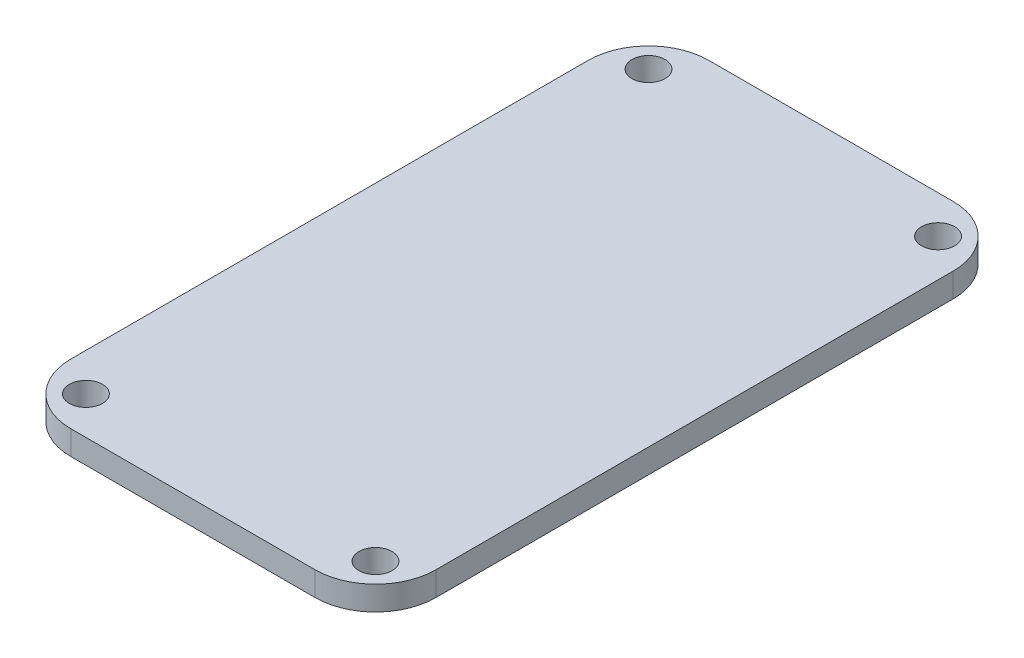
ISO-10303-21;
HEADER;
FILE_DESCRIPTION(('STEP AP214'),'2;1');
FILE_NAME('part.step','',(''),(''),'','','');
FILE_SCHEMA(('AUTOMOTIVE_DESIGN { 1 0 10303 214 1 1 1 1 }'));
ENDSEC;
DATA;
#1=APPLICATION_CONTEXT('core data for automotive mechanical design processes');
#2=APPLICATION_PROTOCOL_DEFINITION('international standard','automotive_design',2000,#1);
#3=PRODUCT_CONTEXT('',#1,'mechanical');
#4=PRODUCT('Part','Part','',(#3));
#5=PRODUCT_RELATED_PRODUCT_CATEGORY('part','',(#4));
#6=PRODUCT_DEFINITION_FORMATION('','',#4);
#7=PRODUCT_DEFINITION_CONTEXT('part definition',#1,'design');
#8=PRODUCT_DEFINITION('design','',#6,#7);
#9=PRODUCT_DEFINITION_SHAPE('','',#8);
#10=(LENGTH_UNIT() NAMED_UNIT(*) SI_UNIT(.MILLI.,.METRE.));
#11=(NAMED_UNIT(*) PLANE_ANGLE_UNIT() SI_UNIT($,.RADIAN.));
#12=(NAMED_UNIT(*) SI_UNIT($,.STERADIAN.) SOLID_ANGLE_UNIT());
#13=UNCERTAINTY_MEASURE_WITH_UNIT(LENGTH_MEASURE(1.E-05),#10,'distance_accuracy_value','');
#14=(GEOMETRIC_REPRESENTATION_CONTEXT(3) GLOBAL_UNCERTAINTY_ASSIGNED_CONTEXT((#13)) GLOBAL_UNIT_ASSIGNED_CONTEXT((#10,
#11,#12)) REPRESENTATION_CONTEXT('',''));
#15=CARTESIAN_POINT('',(0.,0.,0.));
#16=DIRECTION('',(0.,0.,1.));
#17=DIRECTION('',(1.,0.,0.));
#18=AXIS2_PLACEMENT_3D('',#15,#16,#17);
#19=CARTESIAN_POINT('',(12.1,1.6,21.15));
#20=DIRECTION('',(-1.,0.,0.));
#21=DIRECTION('',(0.,0.,1.));
#22=AXIS2_PLACEMENT_3D('',#19,#20,#21);
#23=PLANE('',#22);
#24=DIRECTION('',(0.,0.,-1.));
#25=VECTOR('',#24,1.);
#26=CARTESIAN_POINT('',(12.1,0.,21.15));
#27=LINE('',#26,#25);
#28=CARTESIAN_POINT('',(12.1,0.,17.15));
#29=VERTEX_POINT('',#28);
#30=CARTESIAN_POINT('',(12.1,0.,-17.15));
#31=VERTEX_POINT('',#30);
#32=EDGE_CURVE('E165',#29,#31,#27,.T.);
#33=ORIENTED_EDGE('',*,*,#32,.T.);
#34=DIRECTION('',(0.,-1.,0.));
#35=VECTOR('',#34,1.);
#36=CARTESIAN_POINT('',(12.1,1.6,-17.15));
#37=LINE('',#36,#35);
#38=CARTESIAN_POINT('',(12.1,1.6,-17.15));
#39=VERTEX_POINT('',#38);
#40=EDGE_CURVE('E11',#31,#39,#37,.F.);
#41=ORIENTED_EDGE('',*,*,#40,.T.);
#42=DIRECTION('',(0.,0.,-1.));
#43=VECTOR('',#42,1.);
#44=CARTESIAN_POINT('',(12.1,1.6,21.15));
#45=LINE('',#44,#43);
#46=CARTESIAN_POINT('',(12.1,1.6,17.15));
#47=VERTEX_POINT('',#46);
#48=EDGE_CURVE('E133',#47,#39,#45,.T.);
#49=ORIENTED_EDGE('',*,*,#48,.F.);
#50=DIRECTION('',(0.,-1.,0.));
#51=VECTOR('',#50,1.);
#52=CARTESIAN_POINT('',(12.1,1.6,17.15));
#53=LINE('',#52,#51);
#54=EDGE_CURVE('E49',#47,#29,#53,.T.);
#55=ORIENTED_EDGE('',*,*,#54,.T.);
#56=EDGE_LOOP('',(#33,#41,#49,#55));
#57=FACE_BOUND('',#56,.T.);
#58=ADVANCED_FACE('F41',(#57),#23,.F.);
#59=CARTESIAN_POINT('',(-12.1,1.6,-21.15));
#60=DIRECTION('',(0.,0.,1.));
#61=DIRECTION('',(1.,0.,0.));
#62=AXIS2_PLACEMENT_3D('',#59,#60,#61);
#63=PLANE('',#62);
#64=DIRECTION('',(-1.,0.,0.));
#65=VECTOR('',#64,1.);
#66=CARTESIAN_POINT('',(-12.1,0.,-21.15));
#67=LINE('',#66,#65);
#68=CARTESIAN_POINT('',(8.1,0.,-21.15));
#69=VERTEX_POINT('',#68);
#70=CARTESIAN_POINT('',(-8.1,0.,-21.15));
#71=VERTEX_POINT('',#70);
#72=EDGE_CURVE('E138',#69,#71,#67,.T.);
#73=ORIENTED_EDGE('',*,*,#72,.T.);
#74=DIRECTION('',(0.,-1.,0.));
#75=VECTOR('',#74,1.);
#76=CARTESIAN_POINT('',(-8.1,1.6,-21.15));
#77=LINE('',#76,#75);
#78=CARTESIAN_POINT('',(-8.1,1.6,-21.15));
#79=VERTEX_POINT('',#78);
#80=EDGE_CURVE('E56',#71,#79,#77,.F.);
#81=ORIENTED_EDGE('',*,*,#80,.T.);
#82=DIRECTION('',(-1.,0.,0.));
#83=VECTOR('',#82,1.);
#84=CARTESIAN_POINT('',(-12.1,1.6,-21.15));
#85=LINE('',#84,#83);
#86=CARTESIAN_POINT('',(8.1,1.6,-21.15));
#87=VERTEX_POINT('',#86);
#88=EDGE_CURVE('E136',#87,#79,#85,.T.);
#89=ORIENTED_EDGE('',*,*,#88,.F.);
#90=DIRECTION('',(0.,-1.,0.));
#91=VECTOR('',#90,1.);
#92=CARTESIAN_POINT('',(8.1,1.6,-21.15));
#93=LINE('',#92,#91);
#94=EDGE_CURVE('E157',#87,#69,#93,.T.);
#95=ORIENTED_EDGE('',*,*,#94,.T.);
#96=EDGE_LOOP('',(#73,#81,#89,#95));
#97=FACE_BOUND('',#96,.T.);
#98=ADVANCED_FACE('F225',(#97),#63,.F.);
#99=CARTESIAN_POINT('',(-12.1,1.6,21.15));
#100=DIRECTION('',(1.,0.,0.));
#101=DIRECTION('',(0.,0.,-1.));
#102=AXIS2_PLACEMENT_3D('',#99,#100,#101);
#103=PLANE('',#102);
#104=DIRECTION('',(0.,0.,1.));
#105=VECTOR('',#104,1.);
#106=CARTESIAN_POINT('',(-12.1,0.,21.15));
#107=LINE('',#106,#105);
#108=CARTESIAN_POINT('',(-12.1,0.,-17.15));
#109=VERTEX_POINT('',#108);
#110=CARTESIAN_POINT('',(-12.1,0.,17.15));
#111=VERTEX_POINT('',#110);
#112=EDGE_CURVE('E134',#109,#111,#107,.T.);
#113=ORIENTED_EDGE('',*,*,#112,.T.);
#114=DIRECTION('',(0.,-1.,0.));
#115=VECTOR('',#114,1.);
#116=CARTESIAN_POINT('',(-12.1,1.6,17.15));
#117=LINE('',#116,#115);
#118=CARTESIAN_POINT('',(-12.1,1.6,17.15));
#119=VERTEX_POINT('',#118);
#120=EDGE_CURVE('E112',#111,#119,#117,.F.);
#121=ORIENTED_EDGE('',*,*,#120,.T.);
#122=DIRECTION('',(0.,0.,1.));
#123=VECTOR('',#122,1.);
#124=CARTESIAN_POINT('',(-12.1,1.6,21.15));
#125=LINE('',#124,#123);
#126=CARTESIAN_POINT('',(-12.1,1.6,-17.15));
#127=VERTEX_POINT('',#126);
#128=EDGE_CURVE('E177',#127,#119,#125,.T.);
#129=ORIENTED_EDGE('',*,*,#128,.F.);
#130=DIRECTION('',(0.,-1.,0.));
#131=VECTOR('',#130,1.);
#132=CARTESIAN_POINT('',(-12.1,1.6,-17.15));
#133=LINE('',#132,#131);
#134=EDGE_CURVE('E117',#127,#109,#133,.T.);
#135=ORIENTED_EDGE('',*,*,#134,.T.);
#136=EDGE_LOOP('',(#113,#121,#129,#135));
#137=FACE_BOUND('',#136,.T.);
#138=ADVANCED_FACE('F222',(#137),#103,.F.);
#139=CARTESIAN_POINT('',(-12.1,1.6,21.15));
#140=DIRECTION('',(0.,0.,-1.));
#141=DIRECTION('',(-1.,0.,0.));
#142=AXIS2_PLACEMENT_3D('',#139,#140,#141);
#143=PLANE('',#142);
#144=DIRECTION('',(1.,0.,0.));
#145=VECTOR('',#144,1.);
#146=CARTESIAN_POINT('',(-12.1,1.6,21.15));
#147=LINE('',#146,#145);
#148=CARTESIAN_POINT('',(-8.1,1.6,21.15));
#149=VERTEX_POINT('',#148);
#150=CARTESIAN_POINT('',(8.1,1.6,21.15));
#151=VERTEX_POINT('',#150);
#152=EDGE_CURVE('E127',#149,#151,#147,.T.);
#153=ORIENTED_EDGE('',*,*,#152,.F.);
#154=DIRECTION('',(0.,-1.,0.));
#155=VECTOR('',#154,1.);
#156=CARTESIAN_POINT('',(-8.1,1.6,21.15));
#157=LINE('',#156,#155);
#158=CARTESIAN_POINT('',(-8.1,0.,21.15));
#159=VERTEX_POINT('',#158);
#160=EDGE_CURVE('E111',#149,#159,#157,.T.);
#161=ORIENTED_EDGE('',*,*,#160,.T.);
#162=DIRECTION('',(1.,0.,0.));
#163=VECTOR('',#162,1.);
#164=CARTESIAN_POINT('',(-12.1,0.,21.15));
#165=LINE('',#164,#163);
#166=CARTESIAN_POINT('',(8.1,0.,21.15));
#167=VERTEX_POINT('',#166);
#168=EDGE_CURVE('E124',#159,#167,#165,.T.);
#169=ORIENTED_EDGE('',*,*,#168,.T.);
#170=DIRECTION('',(0.,-1.,0.));
#171=VECTOR('',#170,1.);
#172=CARTESIAN_POINT('',(8.1,1.6,21.15));
#173=LINE('',#172,#171);
#174=EDGE_CURVE('E129',#167,#151,#173,.F.);
#175=ORIENTED_EDGE('',*,*,#174,.T.);
#176=EDGE_LOOP('',(#153,#161,#169,#175));
#177=FACE_BOUND('',#176,.T.);
#178=ADVANCED_FACE('F123',(#177),#143,.F.);
#179=CARTESIAN_POINT('',(0.,1.6,0.));
#180=DIRECTION('',(0.,-1.,0.));
#181=DIRECTION('',(0.,0.,-1.));
#182=AXIS2_PLACEMENT_3D('',#179,#180,#181);
#183=PLANE('',#182);
#184=CARTESIAN_POINT('',(-9.60000000000001,1.6,18.65));
#185=DIRECTION('',(0.,-1.,0.));
#186=DIRECTION('',(0.,0.,-1.));
#187=AXIS2_PLACEMENT_3D('',#184,#185,#186);
#188=CIRCLE('',#187,1.1);
#189=CARTESIAN_POINT('',(-9.60000000000001,1.6,17.55));
#190=VERTEX_POINT('',#189);
#191=EDGE_CURVE('E170',#190,#190,#188,.T.);
#192=ORIENTED_EDGE('',*,*,#191,.T.);
#193=EDGE_LOOP('',(#192));
#194=FACE_BOUND('',#193,.T.);
#195=CARTESIAN_POINT('',(9.60000000000002,1.6,18.65));
#196=DIRECTION('',(0.,-1.,0.));
#197=DIRECTION('',(0.,0.,-1.));
#198=AXIS2_PLACEMENT_3D('',#195,#196,#197);
#199=CIRCLE('',#198,1.1);
#200=CARTESIAN_POINT('',(9.60000000000002,1.6,17.55));
#201=VERTEX_POINT('',#200);
#202=EDGE_CURVE('E173',#201,#201,#199,.T.);
#203=ORIENTED_EDGE('',*,*,#202,.T.);
#204=EDGE_LOOP('',(#203));
#205=FACE_BOUND('',#204,.T.);
#206=CARTESIAN_POINT('',(9.60000000000002,1.6,-18.65));
#207=DIRECTION('',(0.,-1.,0.));
#208=DIRECTION('',(0.,0.,-1.));
#209=AXIS2_PLACEMENT_3D('',#206,#207,#208);
#210=CIRCLE('',#209,1.1);
#211=CARTESIAN_POINT('',(9.60000000000002,1.6,-19.75));
#212=VERTEX_POINT('',#211);
#213=EDGE_CURVE('E183',#212,#212,#210,.T.);
#214=ORIENTED_EDGE('',*,*,#213,.T.);
#215=EDGE_LOOP('',(#214));
#216=FACE_BOUND('',#215,.T.);
#217=CARTESIAN_POINT('',(-9.60000000000002,1.6,-18.65));
#218=DIRECTION('',(0.,-1.,0.));
#219=DIRECTION('',(0.,0.,-1.));
#220=AXIS2_PLACEMENT_3D('',#217,#218,#219);
#221=CIRCLE('',#220,1.1);
#222=CARTESIAN_POINT('',(-9.60000000000002,1.6,-19.75));
#223=VERTEX_POINT('',#222);
#224=EDGE_CURVE('E186',#223,#223,#221,.T.);
#225=ORIENTED_EDGE('',*,*,#224,.T.);
#226=EDGE_LOOP('',(#225));
#227=FACE_BOUND('',#226,.T.);
#228=ORIENTED_EDGE('',*,*,#128,.T.);
#229=CARTESIAN_POINT('',(-8.1,1.6,17.15));
#230=DIRECTION('',(0.,-1.,0.));
#231=DIRECTION('',(0.,0.,-1.));
#232=AXIS2_PLACEMENT_3D('',#229,#230,#231);
#233=CIRCLE('',#232,4.);
#234=EDGE_CURVE('E155',#119,#149,#233,.F.);
#235=ORIENTED_EDGE('',*,*,#234,.T.);
#236=ORIENTED_EDGE('',*,*,#152,.T.);
#237=CARTESIAN_POINT('',(8.1,1.6,17.15));
#238=DIRECTION('',(0.,-1.,0.));
#239=DIRECTION('',(0.,0.,-1.));
#240=AXIS2_PLACEMENT_3D('',#237,#238,#239);
#241=CIRCLE('',#240,4.);
#242=EDGE_CURVE('E150',#151,#47,#241,.F.);
#243=ORIENTED_EDGE('',*,*,#242,.T.);
#244=ORIENTED_EDGE('',*,*,#48,.T.);
#245=CARTESIAN_POINT('',(8.1,1.6,-17.15));
#246=DIRECTION('',(0.,-1.,0.));
#247=DIRECTION('',(0.,0.,-1.));
#248=AXIS2_PLACEMENT_3D('',#245,#246,#247);
#249=CIRCLE('',#248,4.);
#250=EDGE_CURVE('E63',#39,#87,#249,.F.);
#251=ORIENTED_EDGE('',*,*,#250,.T.);
#252=ORIENTED_EDGE('',*,*,#88,.T.);
#253=CARTESIAN_POINT('',(-8.1,1.6,-17.15));
#254=DIRECTION('',(0.,-1.,0.));
#255=DIRECTION('',(0.,0.,-1.));
#256=AXIS2_PLACEMENT_3D('',#253,#254,#255);
#257=CIRCLE('',#256,4.);
#258=EDGE_CURVE('E153',#79,#127,#257,.F.);
#259=ORIENTED_EDGE('',*,*,#258,.T.);
#260=EDGE_LOOP('',(#228,#235,#236,#243,#244,#251,#252,#259));
#261=FACE_BOUND('',#260,.T.);
#262=ADVANCED_FACE('F212',(#194,#205,#216,#227,#261),#183,.F.);
#263=CARTESIAN_POINT('',(0.,0.,0.));
#264=DIRECTION('',(0.,-1.,0.));
#265=DIRECTION('',(0.,0.,-1.));
#266=AXIS2_PLACEMENT_3D('',#263,#264,#265);
#267=PLANE('',#266);
#268=CARTESIAN_POINT('',(-9.60000000000001,0.,18.65));
#269=DIRECTION('',(0.,1.,0.));
#270=DIRECTION('',(0.,0.,1.));
#271=AXIS2_PLACEMENT_3D('',#268,#269,#270);
#272=CIRCLE('',#271,1.1);
#273=CARTESIAN_POINT('',(-9.60000000000001,0.,19.75));
#274=VERTEX_POINT('',#273);
#275=EDGE_CURVE('E193',#274,#274,#272,.T.);
#276=ORIENTED_EDGE('',*,*,#275,.T.);
#277=EDGE_LOOP('',(#276));
#278=FACE_BOUND('',#277,.T.);
#279=CARTESIAN_POINT('',(9.60000000000002,0.,18.65));
#280=DIRECTION('',(0.,1.,0.));
#281=DIRECTION('',(0.,0.,1.));
#282=AXIS2_PLACEMENT_3D('',#279,#280,#281);
#283=CIRCLE('',#282,1.1);
#284=CARTESIAN_POINT('',(9.60000000000002,0.,19.75));
#285=VERTEX_POINT('',#284);
#286=EDGE_CURVE('E196',#285,#285,#283,.T.);
#287=ORIENTED_EDGE('',*,*,#286,.T.);
#288=EDGE_LOOP('',(#287));
#289=FACE_BOUND('',#288,.T.);
#290=CARTESIAN_POINT('',(9.60000000000002,0.,-18.65));
#291=DIRECTION('',(0.,1.,0.));
#292=DIRECTION('',(0.,0.,1.));
#293=AXIS2_PLACEMENT_3D('',#290,#291,#292);
#294=CIRCLE('',#293,1.1);
#295=CARTESIAN_POINT('',(9.60000000000002,0.,-17.55));
#296=VERTEX_POINT('',#295);
#297=EDGE_CURVE('E192',#296,#296,#294,.T.);
#298=ORIENTED_EDGE('',*,*,#297,.T.);
#299=EDGE_LOOP('',(#298));
#300=FACE_BOUND('',#299,.T.);
#301=CARTESIAN_POINT('',(-9.60000000000002,0.,-18.65));
#302=DIRECTION('',(0.,1.,0.));
#303=DIRECTION('',(0.,0.,1.));
#304=AXIS2_PLACEMENT_3D('',#301,#302,#303);
#305=CIRCLE('',#304,1.1);
#306=CARTESIAN_POINT('',(-9.60000000000002,0.,-17.55));
#307=VERTEX_POINT('',#306);
#308=EDGE_CURVE('E189',#307,#307,#305,.T.);
#309=ORIENTED_EDGE('',*,*,#308,.T.);
#310=EDGE_LOOP('',(#309));
#311=FACE_BOUND('',#310,.T.);
#312=ORIENTED_EDGE('',*,*,#168,.F.);
#313=CARTESIAN_POINT('',(-8.1,0.,17.15));
#314=DIRECTION('',(0.,-1.,0.));
#315=DIRECTION('',(0.,0.,-1.));
#316=AXIS2_PLACEMENT_3D('',#313,#314,#315);
#317=CIRCLE('',#316,4.);
#318=EDGE_CURVE('E107',#159,#111,#317,.T.);
#319=ORIENTED_EDGE('',*,*,#318,.T.);
#320=ORIENTED_EDGE('',*,*,#112,.F.);
#321=CARTESIAN_POINT('',(-8.1,0.,-17.15));
#322=DIRECTION('',(0.,-1.,0.));
#323=DIRECTION('',(0.,0.,-1.));
#324=AXIS2_PLACEMENT_3D('',#321,#322,#323);
#325=CIRCLE('',#324,4.);
#326=EDGE_CURVE('E118',#109,#71,#325,.T.);
#327=ORIENTED_EDGE('',*,*,#326,.T.);
#328=ORIENTED_EDGE('',*,*,#72,.F.);
#329=CARTESIAN_POINT('',(8.1,0.,-17.15));
#330=DIRECTION('',(0.,-1.,0.));
#331=DIRECTION('',(0.,0.,-1.));
#332=AXIS2_PLACEMENT_3D('',#329,#330,#331);
#333=CIRCLE('',#332,4.);
#334=EDGE_CURVE('E144',#69,#31,#333,.T.);
#335=ORIENTED_EDGE('',*,*,#334,.T.);
#336=ORIENTED_EDGE('',*,*,#32,.F.);
#337=CARTESIAN_POINT('',(8.1,0.,17.15));
#338=DIRECTION('',(0.,-1.,0.));
#339=DIRECTION('',(0.,0.,-1.));
#340=AXIS2_PLACEMENT_3D('',#337,#338,#339);
#341=CIRCLE('',#340,4.);
#342=EDGE_CURVE('E128',#29,#167,#341,.T.);
#343=ORIENTED_EDGE('',*,*,#342,.T.);
#344=EDGE_LOOP('',(#312,#319,#320,#327,#328,#335,#336,#343));
#345=FACE_BOUND('',#344,.T.);
#346=ADVANCED_FACE('F131',(#278,#289,#300,#311,#345),#267,.T.);
#347=CARTESIAN_POINT('',(-8.1,1.6,17.15));
#348=DIRECTION('',(0.,-1.,0.));
#349=DIRECTION('',(0.,0.,-1.));
#350=AXIS2_PLACEMENT_3D('',#347,#348,#349);
#351=CYLINDRICAL_SURFACE('',#350,4.);
#352=ORIENTED_EDGE('',*,*,#234,.F.);
#353=ORIENTED_EDGE('',*,*,#120,.F.);
#354=ORIENTED_EDGE('',*,*,#318,.F.);
#355=ORIENTED_EDGE('',*,*,#160,.F.);
#356=EDGE_LOOP('',(#352,#353,#354,#355));
#357=FACE_BOUND('',#356,.T.);
#358=ADVANCED_FACE('F110',(#357),#351,.T.);
#359=CARTESIAN_POINT('',(-8.1,1.6,-17.15));
#360=DIRECTION('',(0.,-1.,0.));
#361=DIRECTION('',(0.,0.,-1.));
#362=AXIS2_PLACEMENT_3D('',#359,#360,#361);
#363=CYLINDRICAL_SURFACE('',#362,4.);
#364=ORIENTED_EDGE('',*,*,#258,.F.);
#365=ORIENTED_EDGE('',*,*,#80,.F.);
#366=ORIENTED_EDGE('',*,*,#326,.F.);
#367=ORIENTED_EDGE('',*,*,#134,.F.);
#368=EDGE_LOOP('',(#364,#365,#366,#367));
#369=FACE_BOUND('',#368,.T.);
#370=ADVANCED_FACE('F224',(#369),#363,.T.);
#371=CARTESIAN_POINT('',(8.1,1.6,-17.15));
#372=DIRECTION('',(0.,-1.,0.));
#373=DIRECTION('',(0.,0.,-1.));
#374=AXIS2_PLACEMENT_3D('',#371,#372,#373);
#375=CYLINDRICAL_SURFACE('',#374,4.);
#376=ORIENTED_EDGE('',*,*,#250,.F.);
#377=ORIENTED_EDGE('',*,*,#40,.F.);
#378=ORIENTED_EDGE('',*,*,#334,.F.);
#379=ORIENTED_EDGE('',*,*,#94,.F.);
#380=EDGE_LOOP('',(#376,#377,#378,#379));
#381=FACE_BOUND('',#380,.T.);
#382=ADVANCED_FACE('F228',(#381),#375,.T.);
#383=CARTESIAN_POINT('',(8.1,1.6,17.15));
#384=DIRECTION('',(0.,-1.,0.));
#385=DIRECTION('',(0.,0.,-1.));
#386=AXIS2_PLACEMENT_3D('',#383,#384,#385);
#387=CYLINDRICAL_SURFACE('',#386,4.);
#388=ORIENTED_EDGE('',*,*,#242,.F.);
#389=ORIENTED_EDGE('',*,*,#174,.F.);
#390=ORIENTED_EDGE('',*,*,#342,.F.);
#391=ORIENTED_EDGE('',*,*,#54,.F.);
#392=EDGE_LOOP('',(#388,#389,#390,#391));
#393=FACE_BOUND('',#392,.T.);
#394=ADVANCED_FACE('F43',(#393),#387,.T.);
#395=CARTESIAN_POINT('',(-9.60000000000002,0.,-18.65));
#396=DIRECTION('',(0.,1.,0.));
#397=DIRECTION('',(0.,0.,1.));
#398=AXIS2_PLACEMENT_3D('',#395,#396,#397);
#399=CYLINDRICAL_SURFACE('',#398,1.1);
#400=ORIENTED_EDGE('',*,*,#308,.F.);
#401=EDGE_LOOP('',(#400));
#402=FACE_BOUND('',#401,.T.);
#403=ORIENTED_EDGE('',*,*,#224,.F.);
#404=EDGE_LOOP('',(#403));
#405=FACE_BOUND('',#404,.T.);
#406=ADVANCED_FACE('F208',(#402,#405),#399,.F.);
#407=CARTESIAN_POINT('',(9.60000000000002,0.,-18.65));
#408=DIRECTION('',(0.,1.,0.));
#409=DIRECTION('',(0.,0.,1.));
#410=AXIS2_PLACEMENT_3D('',#407,#408,#409);
#411=CYLINDRICAL_SURFACE('',#410,1.1);
#412=ORIENTED_EDGE('',*,*,#297,.F.);
#413=EDGE_LOOP('',(#412));
#414=FACE_BOUND('',#413,.T.);
#415=ORIENTED_EDGE('',*,*,#213,.F.);
#416=EDGE_LOOP('',(#415));
#417=FACE_BOUND('',#416,.T.);
#418=ADVANCED_FACE('F204',(#414,#417),#411,.F.);
#419=CARTESIAN_POINT('',(9.60000000000002,0.,18.65));
#420=DIRECTION('',(0.,1.,0.));
#421=DIRECTION('',(0.,0.,1.));
#422=AXIS2_PLACEMENT_3D('',#419,#420,#421);
#423=CYLINDRICAL_SURFACE('',#422,1.1);
#424=ORIENTED_EDGE('',*,*,#286,.F.);
#425=EDGE_LOOP('',(#424));
#426=FACE_BOUND('',#425,.T.);
#427=ORIENTED_EDGE('',*,*,#202,.F.);
#428=EDGE_LOOP('',(#427));
#429=FACE_BOUND('',#428,.T.);
#430=ADVANCED_FACE('F207',(#426,#429),#423,.F.);
#431=CARTESIAN_POINT('',(-9.60000000000001,0.,18.65));
#432=DIRECTION('',(0.,1.,0.));
#433=DIRECTION('',(0.,0.,1.));
#434=AXIS2_PLACEMENT_3D('',#431,#432,#433);
#435=CYLINDRICAL_SURFACE('',#434,1.1);
#436=ORIENTED_EDGE('',*,*,#275,.F.);
#437=EDGE_LOOP('',(#436));
#438=FACE_BOUND('',#437,.T.);
#439=ORIENTED_EDGE('',*,*,#191,.F.);
#440=EDGE_LOOP('',(#439));
#441=FACE_BOUND('',#440,.T.);
#442=ADVANCED_FACE('F284',(#438,#441),#435,.F.);
#443=CLOSED_SHELL('',(#58,#98,#138,#178,#262,#346,#358,#370,#382,#394,#406,#418,#430,#442));
#444=MANIFOLD_SOLID_BREP('B2',#443);
#445=ADVANCED_BREP_SHAPE_REPRESENTATION('',(#18,#444),#14);
#446=SHAPE_DEFINITION_REPRESENTATION(#9,#445);
ENDSEC;
END-ISO-10303-21;
